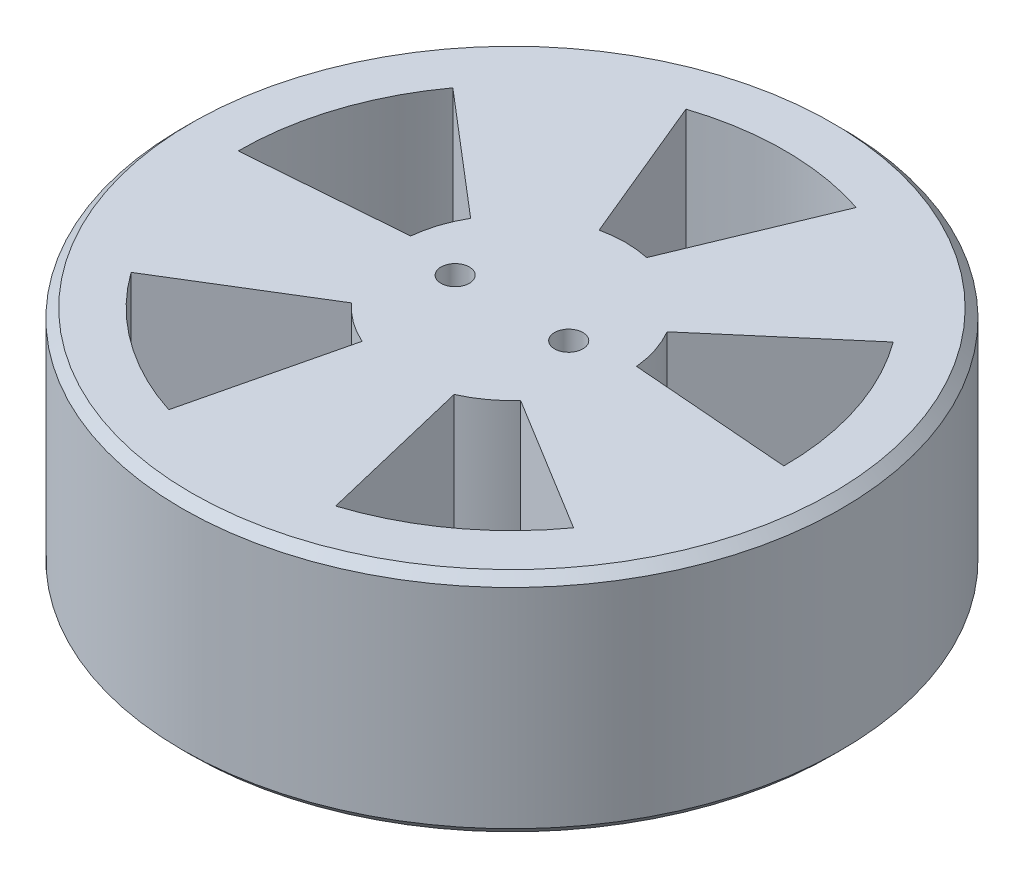
ISO-10303-21;
HEADER;
FILE_DESCRIPTION(('STEP AP214'),'2;1');
FILE_NAME('part.step','',(''),(''),'','','');
FILE_SCHEMA(('AUTOMOTIVE_DESIGN { 1 0 10303 214 1 1 1 1 }'));
ENDSEC;
DATA;
#1=APPLICATION_CONTEXT('core data for automotive mechanical design processes');
#2=APPLICATION_PROTOCOL_DEFINITION('international standard','automotive_design',2000,#1);
#3=PRODUCT_CONTEXT('',#1,'mechanical');
#4=PRODUCT('Part','Part','',(#3));
#5=PRODUCT_RELATED_PRODUCT_CATEGORY('part','',(#4));
#6=PRODUCT_DEFINITION_FORMATION('','',#4);
#7=PRODUCT_DEFINITION_CONTEXT('part definition',#1,'design');
#8=PRODUCT_DEFINITION('design','',#6,#7);
#9=PRODUCT_DEFINITION_SHAPE('','',#8);
#10=(LENGTH_UNIT() NAMED_UNIT(*) SI_UNIT(.MILLI.,.METRE.));
#11=(NAMED_UNIT(*) PLANE_ANGLE_UNIT() SI_UNIT($,.RADIAN.));
#12=(NAMED_UNIT(*) SI_UNIT($,.STERADIAN.) SOLID_ANGLE_UNIT());
#13=UNCERTAINTY_MEASURE_WITH_UNIT(LENGTH_MEASURE(1.E-05),#10,'distance_accuracy_value','');
#14=(GEOMETRIC_REPRESENTATION_CONTEXT(3) GLOBAL_UNCERTAINTY_ASSIGNED_CONTEXT((#13)) GLOBAL_UNIT_ASSIGNED_CONTEXT((#10,
#11,#12)) REPRESENTATION_CONTEXT('',''));
#15=CARTESIAN_POINT('',(0.,0.,0.));
#16=DIRECTION('',(0.,0.,1.));
#17=DIRECTION('',(1.,0.,0.));
#18=AXIS2_PLACEMENT_3D('',#15,#16,#17);
#19=CARTESIAN_POINT('',(0.,50.8,0.));
#20=DIRECTION('',(0.,1.,0.));
#21=DIRECTION('',(0.,0.,1.));
#22=AXIS2_PLACEMENT_3D('',#19,#20,#21);
#23=PLANE('',#22);
#24=CARTESIAN_POINT('',(-12.7,50.8,0.));
#25=DIRECTION('',(0.,1.,0.));
#26=DIRECTION('',(0.,0.,1.));
#27=AXIS2_PLACEMENT_3D('',#24,#25,#26);
#28=CIRCLE('',#27,3.175);
#29=CARTESIAN_POINT('',(-12.7,50.8,3.175));
#30=VERTEX_POINT('',#29);
#31=EDGE_CURVE('E298',#30,#30,#28,.T.);
#32=ORIENTED_EDGE('',*,*,#31,.F.);
#33=EDGE_LOOP('',(#32));
#34=FACE_BOUND('',#33,.T.);
#35=CARTESIAN_POINT('',(12.7,50.8,0.));
#36=DIRECTION('',(0.,1.,0.));
#37=DIRECTION('',(0.,0.,1.));
#38=AXIS2_PLACEMENT_3D('',#35,#36,#37);
#39=CIRCLE('',#38,3.175);
#40=CARTESIAN_POINT('',(12.7,50.8,3.175));
#41=VERTEX_POINT('',#40);
#42=EDGE_CURVE('E292',#41,#41,#39,.T.);
#43=ORIENTED_EDGE('',*,*,#42,.F.);
#44=EDGE_LOOP('',(#43));
#45=FACE_BOUND('',#44,.T.);
#46=CARTESIAN_POINT('',(0.,50.8,0.));
#47=DIRECTION('',(0.,1.,0.));
#48=DIRECTION('',(0.,0.,1.));
#49=AXIS2_PLACEMENT_3D('',#46,#47,#48);
#50=CIRCLE('',#49,71.6915000000001);
#51=CARTESIAN_POINT('',(0.,50.8,71.6915000000001));
#52=VERTEX_POINT('',#51);
#53=EDGE_CURVE('E11',#52,#52,#50,.T.);
#54=ORIENTED_EDGE('',*,*,#53,.T.);
#55=EDGE_LOOP('',(#54));
#56=FACE_BOUND('',#55,.T.);
#57=DIRECTION('',(-0.760405965600023,0.,-0.649448048330193));
#58=VECTOR('',#57,1.);
#59=CARTESIAN_POINT('',(-21.9751179277728,50.8,-12.7379037545617));
#60=LINE('',#59,#58);
#61=CARTESIAN_POINT('',(-21.9751179277728,50.8,-12.7379037545617));
#62=VERTEX_POINT('',#61);
#63=CARTESIAN_POINT('',(-49.2496157699846,50.8,-36.0325255673105));
#64=VERTEX_POINT('',#63);
#65=EDGE_CURVE('E281',#62,#64,#60,.T.);
#66=ORIENTED_EDGE('',*,*,#65,.F.);
#67=CARTESIAN_POINT('',(0.,50.8,0.));
#68=DIRECTION('',(0.,1.,0.));
#69=DIRECTION('',(0.,0.,1.));
#70=AXIS2_PLACEMENT_3D('',#67,#68,#69);
#71=CIRCLE('',#70,25.4);
#72=CARTESIAN_POINT('',(-25.265395829014,50.8,-2.61146962518046));
#73=VERTEX_POINT('',#72);
#74=EDGE_CURVE('E315',#62,#73,#71,.T.);
#75=ORIENTED_EDGE('',*,*,#74,.T.);
#76=DIRECTION('',(-0.996917333733129,0.,0.0784590957278343));
#77=VECTOR('',#76,1.);
#78=CARTESIAN_POINT('',(-25.265395829014,50.8,-2.61146962518046));
#79=LINE('',#78,#77);
#80=CARTESIAN_POINT('',(-61.0231632556706,50.8,0.202727703534772));
#81=VERTEX_POINT('',#80);
#82=EDGE_CURVE('E312',#73,#81,#79,.T.);
#83=ORIENTED_EDGE('',*,*,#82,.T.);
#84=CARTESIAN_POINT('',(0.,50.8,0.));
#85=DIRECTION('',(0.,1.,0.));
#86=DIRECTION('',(0.,0.,1.));
#87=AXIS2_PLACEMENT_3D('',#84,#85,#86);
#88=CIRCLE('',#87,61.0235);
#89=EDGE_CURVE('E310',#64,#81,#88,.T.);
#90=ORIENTED_EDGE('',*,*,#89,.F.);
#91=EDGE_LOOP('',(#66,#75,#83,#90));
#92=FACE_BOUND('',#91,.T.);
#93=DIRECTION('',(-0.852640164354097,0.,0.52249856471594));
#94=VECTOR('',#93,1.);
#95=CARTESIAN_POINT('',(-18.9051512627918,50.8,16.9633503686908));
#96=LINE('',#95,#94);
#97=CARTESIAN_POINT('',(-18.9051512627918,50.8,16.9633503686908));
#98=VERTEX_POINT('',#97);
#99=CARTESIAN_POINT('',(-49.4879364787239,50.8,35.7045052525278));
#100=VERTEX_POINT('',#99);
#101=EDGE_CURVE('E318',#98,#100,#96,.T.);
#102=ORIENTED_EDGE('',*,*,#101,.F.);
#103=CARTESIAN_POINT('',(0.,50.8,0.));
#104=DIRECTION('',(0.,1.,0.));
#105=DIRECTION('',(0.,0.,1.));
#106=AXIS2_PLACEMENT_3D('',#103,#104,#105);
#107=CIRCLE('',#106,25.4);
#108=CARTESIAN_POINT('',(-10.2910918849099,50.8,23.2218308454855));
#109=VERTEX_POINT('',#108);
#110=EDGE_CURVE('E183',#98,#109,#107,.T.);
#111=ORIENTED_EDGE('',*,*,#110,.T.);
#112=DIRECTION('',(-0.233445363855913,0.,0.972369920397675));
#113=VECTOR('',#112,1.);
#114=CARTESIAN_POINT('',(-10.2910918849099,50.8,23.2218308454855));
#115=LINE('',#114,#113);
#116=CARTESIAN_POINT('',(-18.6643889930386,50.8,58.0991233648713));
#117=VERTEX_POINT('',#116);
#118=EDGE_CURVE('E322',#109,#117,#115,.T.);
#119=ORIENTED_EDGE('',*,*,#118,.T.);
#120=CARTESIAN_POINT('',(0.,50.8,0.));
#121=DIRECTION('',(0.,1.,0.));
#122=DIRECTION('',(0.,0.,1.));
#123=AXIS2_PLACEMENT_3D('',#120,#121,#122);
#124=CIRCLE('',#123,61.0235);
#125=EDGE_CURVE('E320',#100,#117,#124,.T.);
#126=ORIENTED_EDGE('',*,*,#125,.F.);
#127=EDGE_LOOP('',(#102,#111,#119,#126));
#128=FACE_BOUND('',#127,.T.);
#129=DIRECTION('',(0.233445363855899,0.,0.972369920397678));
#130=VECTOR('',#129,1.);
#131=CARTESIAN_POINT('',(10.2910918849096,50.8,23.2218308454856));
#132=LINE('',#131,#130);
#133=CARTESIAN_POINT('',(10.2910918849096,50.8,23.2218308454856));
#134=VERTEX_POINT('',#133);
#135=CARTESIAN_POINT('',(18.6643889930378,50.8,58.0991233648716));
#136=VERTEX_POINT('',#135);
#137=EDGE_CURVE('E326',#134,#136,#132,.T.);
#138=ORIENTED_EDGE('',*,*,#137,.F.);
#139=CARTESIAN_POINT('',(0.,50.8,0.));
#140=DIRECTION('',(0.,1.,0.));
#141=DIRECTION('',(0.,0.,1.));
#142=AXIS2_PLACEMENT_3D('',#139,#140,#141);
#143=CIRCLE('',#142,25.4);
#144=CARTESIAN_POINT('',(18.9051512627915,50.8,16.9633503686911));
#145=VERTEX_POINT('',#144);
#146=EDGE_CURVE('E333',#134,#145,#143,.T.);
#147=ORIENTED_EDGE('',*,*,#146,.T.);
#148=DIRECTION('',(0.85264016435409,0.,0.522498564715953));
#149=VECTOR('',#148,1.);
#150=CARTESIAN_POINT('',(18.9051512627915,50.8,16.9633503686911));
#151=LINE('',#150,#149);
#152=CARTESIAN_POINT('',(49.4879364787234,50.8,35.7045052525286));
#153=VERTEX_POINT('',#152);
#154=EDGE_CURVE('E330',#145,#153,#151,.T.);
#155=ORIENTED_EDGE('',*,*,#154,.T.);
#156=CARTESIAN_POINT('',(0.,50.8,0.));
#157=DIRECTION('',(0.,1.,0.));
#158=DIRECTION('',(0.,0.,1.));
#159=AXIS2_PLACEMENT_3D('',#156,#157,#158);
#160=CIRCLE('',#159,61.0235);
#161=EDGE_CURVE('E328',#136,#153,#160,.T.);
#162=ORIENTED_EDGE('',*,*,#161,.F.);
#163=EDGE_LOOP('',(#138,#147,#155,#162));
#164=FACE_BOUND('',#163,.T.);
#165=DIRECTION('',(0.996917333733128,0.,0.0784590957278489));
#166=VECTOR('',#165,1.);
#167=CARTESIAN_POINT('',(25.2653958290141,50.8,-2.61146962518011));
#168=LINE('',#167,#166);
#169=CARTESIAN_POINT('',(25.2653958290141,50.8,-2.61146962518011));
#170=VERTEX_POINT('',#169);
#171=CARTESIAN_POINT('',(61.0231632556706,50.8,0.202727703535641));
#172=VERTEX_POINT('',#171);
#173=EDGE_CURVE('E336',#170,#172,#168,.T.);
#174=ORIENTED_EDGE('',*,*,#173,.F.);
#175=CARTESIAN_POINT('',(0.,50.8,0.));
#176=DIRECTION('',(0.,1.,0.));
#177=DIRECTION('',(0.,0.,1.));
#178=AXIS2_PLACEMENT_3D('',#175,#176,#177);
#179=CIRCLE('',#178,25.4);
#180=CARTESIAN_POINT('',(21.975117927773,50.8,-12.7379037545614));
#181=VERTEX_POINT('',#180);
#182=EDGE_CURVE('E343',#170,#181,#179,.T.);
#183=ORIENTED_EDGE('',*,*,#182,.T.);
#184=DIRECTION('',(0.760405965600032,0.,-0.649448048330182));
#185=VECTOR('',#184,1.);
#186=CARTESIAN_POINT('',(21.975117927773,50.8,-12.7379037545614));
#187=LINE('',#186,#185);
#188=CARTESIAN_POINT('',(49.2496157699852,50.8,-36.0325255673097));
#189=VERTEX_POINT('',#188);
#190=EDGE_CURVE('E340',#181,#189,#187,.T.);
#191=ORIENTED_EDGE('',*,*,#190,.T.);
#192=CARTESIAN_POINT('',(0.,50.8,0.));
#193=DIRECTION('',(0.,1.,0.));
#194=DIRECTION('',(0.,0.,1.));
#195=AXIS2_PLACEMENT_3D('',#192,#193,#194);
#196=CIRCLE('',#195,61.0235);
#197=EDGE_CURVE('E338',#172,#189,#196,.T.);
#198=ORIENTED_EDGE('',*,*,#197,.F.);
#199=EDGE_LOOP('',(#174,#183,#191,#198));
#200=FACE_BOUND('',#199,.T.);
#201=CARTESIAN_POINT('',(0.,50.8,0.));
#202=DIRECTION('',(0.,1.,0.));
#203=DIRECTION('',(0.,0.,1.));
#204=AXIS2_PLACEMENT_3D('',#201,#202,#203);
#205=CIRCLE('',#204,25.4);
#206=CARTESIAN_POINT('',(5.32378147664079,50.8,-24.8358078344349));
#207=VERTEX_POINT('',#206);
#208=CARTESIAN_POINT('',(-5.3237814766408,50.8,-24.8358078344349));
#209=VERTEX_POINT('',#208);
#210=EDGE_CURVE('E346',#207,#209,#205,.T.);
#211=ORIENTED_EDGE('',*,*,#210,.T.);
#212=DIRECTION('',(-0.38268343236509,0.,-0.923879532511286));
#213=VECTOR('',#212,1.);
#214=CARTESIAN_POINT('',(-5.3237814766408,50.8,-24.8358078344349));
#215=LINE('',#214,#213);
#216=CARTESIAN_POINT('',(-19.05,50.8,-57.9738307536254));
#217=VERTEX_POINT('',#216);
#218=EDGE_CURVE('E46',#209,#217,#215,.T.);
#219=ORIENTED_EDGE('',*,*,#218,.T.);
#220=CARTESIAN_POINT('',(0.,50.8,0.));
#221=DIRECTION('',(0.,1.,0.));
#222=DIRECTION('',(0.,0.,1.));
#223=AXIS2_PLACEMENT_3D('',#220,#221,#222);
#224=CIRCLE('',#223,61.0235);
#225=CARTESIAN_POINT('',(19.05,50.8,-57.9738307536254));
#226=VERTEX_POINT('',#225);
#227=EDGE_CURVE('E350',#217,#226,#224,.F.);
#228=ORIENTED_EDGE('',*,*,#227,.T.);
#229=DIRECTION('',(0.382683432365091,0.,-0.923879532511286));
#230=VECTOR('',#229,1.);
#231=CARTESIAN_POINT('',(5.32378147664079,50.8,-24.8358078344349));
#232=LINE('',#231,#230);
#233=EDGE_CURVE('E349',#207,#226,#232,.T.);
#234=ORIENTED_EDGE('',*,*,#233,.F.);
#235=EDGE_LOOP('',(#211,#219,#228,#234));
#236=FACE_BOUND('',#235,.T.);
#237=ADVANCED_FACE('F41',(#34,#45,#56,#92,#128,#164,#200,#236),#23,.T.);
#238=CARTESIAN_POINT('',(0.,0.,0.));
#239=DIRECTION('',(0.,1.,0.));
#240=DIRECTION('',(0.,0.,1.));
#241=AXIS2_PLACEMENT_3D('',#238,#239,#240);
#242=PLANE('',#241);
#243=CARTESIAN_POINT('',(0.,0.,0.));
#244=DIRECTION('',(0.,1.,0.));
#245=DIRECTION('',(0.,0.,1.));
#246=AXIS2_PLACEMENT_3D('',#243,#244,#245);
#247=CIRCLE('',#246,25.4);
#248=CARTESIAN_POINT('',(25.2653958290141,0.,-2.61146962518011));
#249=VERTEX_POINT('',#248);
#250=CARTESIAN_POINT('',(21.975117927773,0.,-12.7379037545614));
#251=VERTEX_POINT('',#250);
#252=EDGE_CURVE('E220',#249,#251,#247,.T.);
#253=ORIENTED_EDGE('',*,*,#252,.F.);
#254=DIRECTION('',(0.996917333733128,0.,0.0784590957278489));
#255=VECTOR('',#254,1.);
#256=CARTESIAN_POINT('',(25.2653958290141,0.,-2.61146962518011));
#257=LINE('',#256,#255);
#258=CARTESIAN_POINT('',(61.0231632556706,0.,0.202727703535643));
#259=VERTEX_POINT('',#258);
#260=EDGE_CURVE('E233',#249,#259,#257,.T.);
#261=ORIENTED_EDGE('',*,*,#260,.T.);
#262=CARTESIAN_POINT('',(0.,0.,0.));
#263=DIRECTION('',(0.,1.,0.));
#264=DIRECTION('',(0.,0.,1.));
#265=AXIS2_PLACEMENT_3D('',#262,#263,#264);
#266=CIRCLE('',#265,61.0235);
#267=CARTESIAN_POINT('',(49.2496157699852,0.,-36.0325255673098));
#268=VERTEX_POINT('',#267);
#269=EDGE_CURVE('E246',#259,#268,#266,.T.);
#270=ORIENTED_EDGE('',*,*,#269,.T.);
#271=DIRECTION('',(0.760405965600032,0.,-0.649448048330182));
#272=VECTOR('',#271,1.);
#273=CARTESIAN_POINT('',(21.975117927773,0.,-12.7379037545614));
#274=LINE('',#273,#272);
#275=EDGE_CURVE('E249',#251,#268,#274,.T.);
#276=ORIENTED_EDGE('',*,*,#275,.F.);
#277=EDGE_LOOP('',(#253,#261,#270,#276));
#278=FACE_BOUND('',#277,.T.);
#279=CARTESIAN_POINT('',(0.,0.,0.));
#280=DIRECTION('',(0.,1.,0.));
#281=DIRECTION('',(0.,0.,1.));
#282=AXIS2_PLACEMENT_3D('',#279,#280,#281);
#283=CIRCLE('',#282,25.4);
#284=CARTESIAN_POINT('',(-18.9051512627918,0.,16.9633503686908));
#285=VERTEX_POINT('',#284);
#286=CARTESIAN_POINT('',(-10.2910918849099,0.,23.2218308454855));
#287=VERTEX_POINT('',#286);
#288=EDGE_CURVE('E180',#285,#287,#283,.T.);
#289=ORIENTED_EDGE('',*,*,#288,.F.);
#290=DIRECTION('',(-0.852640164354098,0.,0.52249856471594));
#291=VECTOR('',#290,1.);
#292=CARTESIAN_POINT('',(-18.9051512627918,0.,16.9633503686908));
#293=LINE('',#292,#291);
#294=CARTESIAN_POINT('',(-49.4879364787239,0.,35.7045052525278));
#295=VERTEX_POINT('',#294);
#296=EDGE_CURVE('E186',#285,#295,#293,.T.);
#297=ORIENTED_EDGE('',*,*,#296,.T.);
#298=CARTESIAN_POINT('',(0.,0.,0.));
#299=DIRECTION('',(0.,1.,0.));
#300=DIRECTION('',(0.,0.,1.));
#301=AXIS2_PLACEMENT_3D('',#298,#299,#300);
#302=CIRCLE('',#301,61.0235);
#303=CARTESIAN_POINT('',(-18.6643889930386,0.,58.0991233648713));
#304=VERTEX_POINT('',#303);
#305=EDGE_CURVE('E195',#295,#304,#302,.T.);
#306=ORIENTED_EDGE('',*,*,#305,.T.);
#307=DIRECTION('',(-0.233445363855913,0.,0.972369920397675));
#308=VECTOR('',#307,1.);
#309=CARTESIAN_POINT('',(-10.2910918849099,0.,23.2218308454855));
#310=LINE('',#309,#308);
#311=EDGE_CURVE('E200',#287,#304,#310,.T.);
#312=ORIENTED_EDGE('',*,*,#311,.F.);
#313=EDGE_LOOP('',(#289,#297,#306,#312));
#314=FACE_BOUND('',#313,.T.);
#315=CARTESIAN_POINT('',(0.,0.,0.));
#316=DIRECTION('',(0.,1.,0.));
#317=DIRECTION('',(0.,0.,1.));
#318=AXIS2_PLACEMENT_3D('',#315,#316,#317);
#319=CIRCLE('',#318,71.6915);
#320=CARTESIAN_POINT('',(0.,0.,71.6915));
#321=VERTEX_POINT('',#320);
#322=EDGE_CURVE('E52',#321,#321,#319,.F.);
#323=ORIENTED_EDGE('',*,*,#322,.T.);
#324=EDGE_LOOP('',(#323));
#325=FACE_BOUND('',#324,.T.);
#326=CARTESIAN_POINT('',(12.7,0.,0.));
#327=DIRECTION('',(0.,1.,0.));
#328=DIRECTION('',(0.,0.,1.));
#329=AXIS2_PLACEMENT_3D('',#326,#327,#328);
#330=CIRCLE('',#329,3.175);
#331=CARTESIAN_POINT('',(12.7,0.,3.175));
#332=VERTEX_POINT('',#331);
#333=EDGE_CURVE('E293',#332,#332,#330,.T.);
#334=ORIENTED_EDGE('',*,*,#333,.T.);
#335=EDGE_LOOP('',(#334));
#336=FACE_BOUND('',#335,.T.);
#337=CARTESIAN_POINT('',(-12.7,0.,0.));
#338=DIRECTION('',(0.,1.,0.));
#339=DIRECTION('',(0.,0.,1.));
#340=AXIS2_PLACEMENT_3D('',#337,#338,#339);
#341=CIRCLE('',#340,3.175);
#342=CARTESIAN_POINT('',(-12.7,0.,3.175));
#343=VERTEX_POINT('',#342);
#344=EDGE_CURVE('E289',#343,#343,#341,.T.);
#345=ORIENTED_EDGE('',*,*,#344,.T.);
#346=EDGE_LOOP('',(#345));
#347=FACE_BOUND('',#346,.T.);
#348=CARTESIAN_POINT('',(0.,0.,0.));
#349=DIRECTION('',(0.,1.,0.));
#350=DIRECTION('',(0.,0.,1.));
#351=AXIS2_PLACEMENT_3D('',#348,#349,#350);
#352=CIRCLE('',#351,25.4);
#353=CARTESIAN_POINT('',(-21.9751179277728,0.,-12.7379037545617));
#354=VERTEX_POINT('',#353);
#355=CARTESIAN_POINT('',(-25.265395829014,0.,-2.61146962518046));
#356=VERTEX_POINT('',#355);
#357=EDGE_CURVE('E201',#354,#356,#352,.T.);
#358=ORIENTED_EDGE('',*,*,#357,.F.);
#359=DIRECTION('',(-0.760405965600023,0.,-0.649448048330193));
#360=VECTOR('',#359,1.);
#361=CARTESIAN_POINT('',(-21.9751179277728,0.,-12.7379037545617));
#362=LINE('',#361,#360);
#363=CARTESIAN_POINT('',(-49.2496157699847,0.,-36.0325255673105));
#364=VERTEX_POINT('',#363);
#365=EDGE_CURVE('E274',#354,#364,#362,.T.);
#366=ORIENTED_EDGE('',*,*,#365,.T.);
#367=CARTESIAN_POINT('',(0.,0.,0.));
#368=DIRECTION('',(0.,1.,0.));
#369=DIRECTION('',(0.,0.,1.));
#370=AXIS2_PLACEMENT_3D('',#367,#368,#369);
#371=CIRCLE('',#370,61.0235);
#372=CARTESIAN_POINT('',(-61.0231632556706,0.,0.202727703534772));
#373=VERTEX_POINT('',#372);
#374=EDGE_CURVE('E271',#364,#373,#371,.T.);
#375=ORIENTED_EDGE('',*,*,#374,.T.);
#376=DIRECTION('',(-0.996917333733129,0.,0.0784590957278344));
#377=VECTOR('',#376,1.);
#378=CARTESIAN_POINT('',(-25.265395829014,0.,-2.61146962518046));
#379=LINE('',#378,#377);
#380=EDGE_CURVE('E203',#356,#373,#379,.T.);
#381=ORIENTED_EDGE('',*,*,#380,.F.);
#382=EDGE_LOOP('',(#358,#366,#375,#381));
#383=FACE_BOUND('',#382,.T.);
#384=CARTESIAN_POINT('',(0.,0.,0.));
#385=DIRECTION('',(0.,1.,0.));
#386=DIRECTION('',(0.,0.,1.));
#387=AXIS2_PLACEMENT_3D('',#384,#385,#386);
#388=CIRCLE('',#387,25.4);
#389=CARTESIAN_POINT('',(10.2910918849096,0.,23.2218308454856));
#390=VERTEX_POINT('',#389);
#391=CARTESIAN_POINT('',(18.9051512627915,0.,16.9633503686911));
#392=VERTEX_POINT('',#391);
#393=EDGE_CURVE('E228',#390,#392,#388,.T.);
#394=ORIENTED_EDGE('',*,*,#393,.F.);
#395=DIRECTION('',(0.233445363855899,0.,0.972369920397678));
#396=VECTOR('',#395,1.);
#397=CARTESIAN_POINT('',(10.2910918849096,0.,23.2218308454856));
#398=LINE('',#397,#396);
#399=CARTESIAN_POINT('',(18.6643889930378,0.,58.0991233648716));
#400=VERTEX_POINT('',#399);
#401=EDGE_CURVE('E210',#390,#400,#398,.T.);
#402=ORIENTED_EDGE('',*,*,#401,.T.);
#403=CARTESIAN_POINT('',(0.,0.,0.));
#404=DIRECTION('',(0.,1.,0.));
#405=DIRECTION('',(0.,0.,1.));
#406=AXIS2_PLACEMENT_3D('',#403,#404,#405);
#407=CIRCLE('',#406,61.0235);
#408=CARTESIAN_POINT('',(49.4879364787234,0.,35.7045052525286));
#409=VERTEX_POINT('',#408);
#410=EDGE_CURVE('E223',#400,#409,#407,.T.);
#411=ORIENTED_EDGE('',*,*,#410,.T.);
#412=DIRECTION('',(0.85264016435409,0.,0.522498564715953));
#413=VECTOR('',#412,1.);
#414=CARTESIAN_POINT('',(18.9051512627915,0.,16.9633503686911));
#415=LINE('',#414,#413);
#416=EDGE_CURVE('E226',#392,#409,#415,.T.);
#417=ORIENTED_EDGE('',*,*,#416,.F.);
#418=EDGE_LOOP('',(#394,#402,#411,#417));
#419=FACE_BOUND('',#418,.T.);
#420=DIRECTION('',(-0.38268343236509,0.,-0.923879532511287));
#421=VECTOR('',#420,1.);
#422=CARTESIAN_POINT('',(-5.3237814766408,0.,-24.8358078344349));
#423=LINE('',#422,#421);
#424=CARTESIAN_POINT('',(-5.32378147664079,0.,-24.8358078344349));
#425=VERTEX_POINT('',#424);
#426=CARTESIAN_POINT('',(-19.05,0.,-57.9738307536254));
#427=VERTEX_POINT('',#426);
#428=EDGE_CURVE('E243',#425,#427,#423,.T.);
#429=ORIENTED_EDGE('',*,*,#428,.F.);
#430=CARTESIAN_POINT('',(0.,0.,0.));
#431=DIRECTION('',(0.,1.,0.));
#432=DIRECTION('',(0.,0.,1.));
#433=AXIS2_PLACEMENT_3D('',#430,#431,#432);
#434=CIRCLE('',#433,25.4);
#435=CARTESIAN_POINT('',(5.32378147664078,0.,-24.8358078344349));
#436=VERTEX_POINT('',#435);
#437=EDGE_CURVE('E253',#436,#425,#434,.T.);
#438=ORIENTED_EDGE('',*,*,#437,.F.);
#439=DIRECTION('',(0.382683432365091,0.,-0.923879532511286));
#440=VECTOR('',#439,1.);
#441=CARTESIAN_POINT('',(5.32378147664079,0.,-24.8358078344349));
#442=LINE('',#441,#440);
#443=CARTESIAN_POINT('',(19.05,0.,-57.9738307536254));
#444=VERTEX_POINT('',#443);
#445=EDGE_CURVE('E264',#436,#444,#442,.T.);
#446=ORIENTED_EDGE('',*,*,#445,.T.);
#447=CARTESIAN_POINT('',(0.,0.,0.));
#448=DIRECTION('',(0.,-1.,0.));
#449=DIRECTION('',(0.,0.,-1.));
#450=AXIS2_PLACEMENT_3D('',#447,#448,#449);
#451=CIRCLE('',#450,61.0235);
#452=EDGE_CURVE('E267',#427,#444,#451,.T.);
#453=ORIENTED_EDGE('',*,*,#452,.F.);
#454=EDGE_LOOP('',(#429,#438,#446,#453));
#455=FACE_BOUND('',#454,.T.);
#456=ADVANCED_FACE('F198',(#278,#314,#325,#336,#347,#383,#419,#455),#242,.F.);
#457=CARTESIAN_POINT('',(0.,50.8,0.));
#458=DIRECTION('',(0.,-1.,0.));
#459=DIRECTION('',(0.,0.,-1.));
#460=AXIS2_PLACEMENT_3D('',#457,#458,#459);
#461=CYLINDRICAL_SURFACE('',#460,73.7235);
#462=CARTESIAN_POINT('',(0.,2.03199999999999,0.));
#463=DIRECTION('',(0.,1.,0.));
#464=DIRECTION('',(0.,0.,1.));
#465=AXIS2_PLACEMENT_3D('',#462,#463,#464);
#466=CIRCLE('',#465,73.7235);
#467=CARTESIAN_POINT('',(0.,2.03199999999999,73.7235));
#468=VERTEX_POINT('',#467);
#469=EDGE_CURVE('E304',#468,#468,#466,.T.);
#470=ORIENTED_EDGE('',*,*,#469,.T.);
#471=EDGE_LOOP('',(#470));
#472=FACE_BOUND('',#471,.T.);
#473=CARTESIAN_POINT('',(0.,48.768,0.));
#474=DIRECTION('',(0.,1.,0.));
#475=DIRECTION('',(0.,0.,1.));
#476=AXIS2_PLACEMENT_3D('',#473,#474,#475);
#477=CIRCLE('',#476,73.7235);
#478=CARTESIAN_POINT('',(0.,48.768,73.7235));
#479=VERTEX_POINT('',#478);
#480=EDGE_CURVE('E301',#479,#479,#477,.F.);
#481=ORIENTED_EDGE('',*,*,#480,.T.);
#482=EDGE_LOOP('',(#481));
#483=FACE_BOUND('',#482,.T.);
#484=ADVANCED_FACE('F384',(#472,#483),#461,.T.);
#485=CARTESIAN_POINT('',(0.,2.03199999999999,0.));
#486=DIRECTION('',(0.,1.,0.));
#487=DIRECTION('',(0.,0.,1.));
#488=AXIS2_PLACEMENT_3D('',#485,#486,#487);
#489=CONICAL_SURFACE('',#488,73.7235,0.785398163397452);
#490=ORIENTED_EDGE('',*,*,#322,.F.);
#491=EDGE_LOOP('',(#490));
#492=FACE_BOUND('',#491,.T.);
#493=ORIENTED_EDGE('',*,*,#469,.F.);
#494=EDGE_LOOP('',(#493));
#495=FACE_BOUND('',#494,.T.);
#496=ADVANCED_FACE('F394',(#492,#495),#489,.T.);
#497=CARTESIAN_POINT('',(0.,50.8,0.));
#498=DIRECTION('',(0.,-1.,0.));
#499=DIRECTION('',(0.,0.,-1.));
#500=AXIS2_PLACEMENT_3D('',#497,#498,#499);
#501=CONICAL_SURFACE('',#500,71.6915000000001,0.785398163397438);
#502=ORIENTED_EDGE('',*,*,#480,.F.);
#503=EDGE_LOOP('',(#502));
#504=FACE_BOUND('',#503,.T.);
#505=ORIENTED_EDGE('',*,*,#53,.F.);
#506=EDGE_LOOP('',(#505));
#507=FACE_BOUND('',#506,.T.);
#508=ADVANCED_FACE('F44',(#504,#507),#501,.T.);
#509=CARTESIAN_POINT('',(12.7,0.,0.));
#510=DIRECTION('',(0.,1.,0.));
#511=DIRECTION('',(0.,0.,1.));
#512=AXIS2_PLACEMENT_3D('',#509,#510,#511);
#513=CYLINDRICAL_SURFACE('',#512,3.175);
#514=ORIENTED_EDGE('',*,*,#42,.T.);
#515=EDGE_LOOP('',(#514));
#516=FACE_BOUND('',#515,.T.);
#517=ORIENTED_EDGE('',*,*,#333,.F.);
#518=EDGE_LOOP('',(#517));
#519=FACE_BOUND('',#518,.T.);
#520=ADVANCED_FACE('F390',(#516,#519),#513,.F.);
#521=CARTESIAN_POINT('',(-12.7,0.,0.));
#522=DIRECTION('',(0.,1.,0.));
#523=DIRECTION('',(0.,0.,1.));
#524=AXIS2_PLACEMENT_3D('',#521,#522,#523);
#525=CYLINDRICAL_SURFACE('',#524,3.175);
#526=ORIENTED_EDGE('',*,*,#31,.T.);
#527=EDGE_LOOP('',(#526));
#528=FACE_BOUND('',#527,.T.);
#529=ORIENTED_EDGE('',*,*,#344,.F.);
#530=EDGE_LOOP('',(#529));
#531=FACE_BOUND('',#530,.T.);
#532=ADVANCED_FACE('F593',(#528,#531),#525,.F.);
#533=CARTESIAN_POINT('',(0.,0.,0.));
#534=DIRECTION('',(0.,1.,0.));
#535=DIRECTION('',(0.,0.,1.));
#536=AXIS2_PLACEMENT_3D('',#533,#534,#535);
#537=CYLINDRICAL_SURFACE('',#536,25.4);
#538=DIRECTION('',(0.,1.,0.));
#539=VECTOR('',#538,1.);
#540=CARTESIAN_POINT('',(-21.9751179277728,0.,-12.7379037545617));
#541=LINE('',#540,#539);
#542=EDGE_CURVE('E277',#354,#62,#541,.T.);
#543=ORIENTED_EDGE('',*,*,#542,.F.);
#544=ORIENTED_EDGE('',*,*,#357,.T.);
#545=DIRECTION('',(0.,1.,0.));
#546=VECTOR('',#545,1.);
#547=CARTESIAN_POINT('',(-25.265395829014,0.,-2.61146962518046));
#548=LINE('',#547,#546);
#549=EDGE_CURVE('E278',#356,#73,#548,.T.);
#550=ORIENTED_EDGE('',*,*,#549,.T.);
#551=ORIENTED_EDGE('',*,*,#74,.F.);
#552=EDGE_LOOP('',(#543,#544,#550,#551));
#553=FACE_BOUND('',#552,.T.);
#554=ADVANCED_FACE('F585',(#553),#537,.T.);
#555=CARTESIAN_POINT('',(-25.265395829014,0.,-2.61146962518046));
#556=DIRECTION('',(-0.0784590957278344,0.,-0.996917333733129));
#557=DIRECTION('',(-0.996917333733129,0.,0.0784590957278344));
#558=AXIS2_PLACEMENT_3D('',#555,#556,#557);
#559=PLANE('',#558);
#560=ORIENTED_EDGE('',*,*,#549,.F.);
#561=ORIENTED_EDGE('',*,*,#380,.T.);
#562=DIRECTION('',(0.,1.,0.));
#563=VECTOR('',#562,1.);
#564=CARTESIAN_POINT('',(-61.0231632556706,0.,0.202727703534772));
#565=LINE('',#564,#563);
#566=EDGE_CURVE('E282',#373,#81,#565,.T.);
#567=ORIENTED_EDGE('',*,*,#566,.T.);
#568=ORIENTED_EDGE('',*,*,#82,.F.);
#569=EDGE_LOOP('',(#560,#561,#567,#568));
#570=FACE_BOUND('',#569,.T.);
#571=ADVANCED_FACE('F576',(#570),#559,.T.);
#572=CARTESIAN_POINT('',(0.,0.,0.));
#573=DIRECTION('',(0.,1.,0.));
#574=DIRECTION('',(0.,0.,1.));
#575=AXIS2_PLACEMENT_3D('',#572,#573,#574);
#576=CYLINDRICAL_SURFACE('',#575,61.0235);
#577=ORIENTED_EDGE('',*,*,#89,.T.);
#578=ORIENTED_EDGE('',*,*,#566,.F.);
#579=ORIENTED_EDGE('',*,*,#374,.F.);
#580=DIRECTION('',(0.,1.,0.));
#581=VECTOR('',#580,1.);
#582=CARTESIAN_POINT('',(-49.2496157699846,0.,-36.0325255673105));
#583=LINE('',#582,#581);
#584=EDGE_CURVE('E285',#364,#64,#583,.T.);
#585=ORIENTED_EDGE('',*,*,#584,.T.);
#586=EDGE_LOOP('',(#577,#578,#579,#585));
#587=FACE_BOUND('',#586,.T.);
#588=ADVANCED_FACE('F568',(#587),#576,.F.);
#589=CARTESIAN_POINT('',(-21.9751179277728,0.,-12.7379037545617));
#590=DIRECTION('',(0.649448048330193,0.,-0.760405965600023));
#591=DIRECTION('',(-0.760405965600023,0.,-0.649448048330193));
#592=AXIS2_PLACEMENT_3D('',#589,#590,#591);
#593=PLANE('',#592);
#594=ORIENTED_EDGE('',*,*,#65,.T.);
#595=ORIENTED_EDGE('',*,*,#584,.F.);
#596=ORIENTED_EDGE('',*,*,#365,.F.);
#597=ORIENTED_EDGE('',*,*,#542,.T.);
#598=EDGE_LOOP('',(#594,#595,#596,#597));
#599=FACE_BOUND('',#598,.T.);
#600=ADVANCED_FACE('F560',(#599),#593,.F.);
#601=CARTESIAN_POINT('',(0.,0.,0.));
#602=DIRECTION('',(0.,1.,0.));
#603=DIRECTION('',(0.,0.,1.));
#604=AXIS2_PLACEMENT_3D('',#601,#602,#603);
#605=CYLINDRICAL_SURFACE('',#604,25.4);
#606=DIRECTION('',(0.,1.,0.));
#607=VECTOR('',#606,1.);
#608=CARTESIAN_POINT('',(-18.9051512627918,0.,16.9633503686908));
#609=LINE('',#608,#607);
#610=EDGE_CURVE('E175',#285,#98,#609,.T.);
#611=ORIENTED_EDGE('',*,*,#610,.F.);
#612=ORIENTED_EDGE('',*,*,#288,.T.);
#613=DIRECTION('',(0.,1.,0.));
#614=VECTOR('',#613,1.);
#615=CARTESIAN_POINT('',(-10.2910918849099,0.,23.2218308454855));
#616=LINE('',#615,#614);
#617=EDGE_CURVE('E230',#287,#109,#616,.T.);
#618=ORIENTED_EDGE('',*,*,#617,.T.);
#619=ORIENTED_EDGE('',*,*,#110,.F.);
#620=EDGE_LOOP('',(#611,#612,#618,#619));
#621=FACE_BOUND('',#620,.T.);
#622=ADVANCED_FACE('F177',(#621),#605,.T.);
#623=CARTESIAN_POINT('',(-10.2910918849099,0.,23.2218308454855));
#624=DIRECTION('',(-0.972369920397675,0.,-0.233445363855913));
#625=DIRECTION('',(-0.233445363855913,0.,0.972369920397675));
#626=AXIS2_PLACEMENT_3D('',#623,#624,#625);
#627=PLANE('',#626);
#628=ORIENTED_EDGE('',*,*,#617,.F.);
#629=ORIENTED_EDGE('',*,*,#311,.T.);
#630=DIRECTION('',(0.,1.,0.));
#631=VECTOR('',#630,1.);
#632=CARTESIAN_POINT('',(-18.6643889930386,0.,58.0991233648713));
#633=LINE('',#632,#631);
#634=EDGE_CURVE('E677',#304,#117,#633,.T.);
#635=ORIENTED_EDGE('',*,*,#634,.T.);
#636=ORIENTED_EDGE('',*,*,#118,.F.);
#637=EDGE_LOOP('',(#628,#629,#635,#636));
#638=FACE_BOUND('',#637,.T.);
#639=ADVANCED_FACE('F543',(#638),#627,.T.);
#640=CARTESIAN_POINT('',(0.,0.,0.));
#641=DIRECTION('',(0.,1.,0.));
#642=DIRECTION('',(0.,0.,1.));
#643=AXIS2_PLACEMENT_3D('',#640,#641,#642);
#644=CYLINDRICAL_SURFACE('',#643,61.0235);
#645=ORIENTED_EDGE('',*,*,#125,.T.);
#646=ORIENTED_EDGE('',*,*,#634,.F.);
#647=ORIENTED_EDGE('',*,*,#305,.F.);
#648=DIRECTION('',(0.,1.,0.));
#649=VECTOR('',#648,1.);
#650=CARTESIAN_POINT('',(-49.4879364787239,0.,35.7045052525278));
#651=LINE('',#650,#649);
#652=EDGE_CURVE('E187',#295,#100,#651,.T.);
#653=ORIENTED_EDGE('',*,*,#652,.T.);
#654=EDGE_LOOP('',(#645,#646,#647,#653));
#655=FACE_BOUND('',#654,.T.);
#656=ADVANCED_FACE('F535',(#655),#644,.F.);
#657=CARTESIAN_POINT('',(-18.9051512627918,0.,16.9633503686908));
#658=DIRECTION('',(-0.52249856471594,0.,-0.852640164354097));
#659=DIRECTION('',(-0.852640164354097,0.,0.52249856471594));
#660=AXIS2_PLACEMENT_3D('',#657,#658,#659);
#661=PLANE('',#660);
#662=ORIENTED_EDGE('',*,*,#101,.T.);
#663=ORIENTED_EDGE('',*,*,#652,.F.);
#664=ORIENTED_EDGE('',*,*,#296,.F.);
#665=ORIENTED_EDGE('',*,*,#610,.T.);
#666=EDGE_LOOP('',(#662,#663,#664,#665));
#667=FACE_BOUND('',#666,.T.);
#668=ADVANCED_FACE('F191',(#667),#661,.F.);
#669=CARTESIAN_POINT('',(0.,0.,0.));
#670=DIRECTION('',(0.,1.,0.));
#671=DIRECTION('',(0.,0.,1.));
#672=AXIS2_PLACEMENT_3D('',#669,#670,#671);
#673=CYLINDRICAL_SURFACE('',#672,25.4);
#674=DIRECTION('',(0.,1.,0.));
#675=VECTOR('',#674,1.);
#676=CARTESIAN_POINT('',(10.2910918849096,0.,23.2218308454856));
#677=LINE('',#676,#675);
#678=EDGE_CURVE('E208',#390,#134,#677,.T.);
#679=ORIENTED_EDGE('',*,*,#678,.F.);
#680=ORIENTED_EDGE('',*,*,#393,.T.);
#681=DIRECTION('',(0.,1.,0.));
#682=VECTOR('',#681,1.);
#683=CARTESIAN_POINT('',(18.9051512627915,0.,16.9633503686911));
#684=LINE('',#683,#682);
#685=EDGE_CURVE('E217',#392,#145,#684,.T.);
#686=ORIENTED_EDGE('',*,*,#685,.T.);
#687=ORIENTED_EDGE('',*,*,#146,.F.);
#688=EDGE_LOOP('',(#679,#680,#686,#687));
#689=FACE_BOUND('',#688,.T.);
#690=ADVANCED_FACE('F518',(#689),#673,.T.);
#691=CARTESIAN_POINT('',(18.9051512627915,0.,16.9633503686911));
#692=DIRECTION('',(-0.522498564715953,0.,0.85264016435409));
#693=DIRECTION('',(0.85264016435409,0.,0.522498564715953));
#694=AXIS2_PLACEMENT_3D('',#691,#692,#693);
#695=PLANE('',#694);
#696=ORIENTED_EDGE('',*,*,#685,.F.);
#697=ORIENTED_EDGE('',*,*,#416,.T.);
#698=DIRECTION('',(0.,1.,0.));
#699=VECTOR('',#698,1.);
#700=CARTESIAN_POINT('',(49.4879364787234,0.,35.7045052525286));
#701=LINE('',#700,#699);
#702=EDGE_CURVE('E214',#409,#153,#701,.T.);
#703=ORIENTED_EDGE('',*,*,#702,.T.);
#704=ORIENTED_EDGE('',*,*,#154,.F.);
#705=EDGE_LOOP('',(#696,#697,#703,#704));
#706=FACE_BOUND('',#705,.T.);
#707=ADVANCED_FACE('F509',(#706),#695,.T.);
#708=CARTESIAN_POINT('',(0.,0.,0.));
#709=DIRECTION('',(0.,1.,0.));
#710=DIRECTION('',(0.,0.,1.));
#711=AXIS2_PLACEMENT_3D('',#708,#709,#710);
#712=CYLINDRICAL_SURFACE('',#711,61.0235);
#713=ORIENTED_EDGE('',*,*,#161,.T.);
#714=ORIENTED_EDGE('',*,*,#702,.F.);
#715=ORIENTED_EDGE('',*,*,#410,.F.);
#716=DIRECTION('',(0.,1.,0.));
#717=VECTOR('',#716,1.);
#718=CARTESIAN_POINT('',(18.6643889930378,0.,58.0991233648716));
#719=LINE('',#718,#717);
#720=EDGE_CURVE('E211',#400,#136,#719,.T.);
#721=ORIENTED_EDGE('',*,*,#720,.T.);
#722=EDGE_LOOP('',(#713,#714,#715,#721));
#723=FACE_BOUND('',#722,.T.);
#724=ADVANCED_FACE('F501',(#723),#712,.F.);
#725=CARTESIAN_POINT('',(10.2910918849096,0.,23.2218308454856));
#726=DIRECTION('',(-0.972369920397678,0.,0.233445363855899));
#727=DIRECTION('',(0.233445363855899,0.,0.972369920397678));
#728=AXIS2_PLACEMENT_3D('',#725,#726,#727);
#729=PLANE('',#728);
#730=ORIENTED_EDGE('',*,*,#137,.T.);
#731=ORIENTED_EDGE('',*,*,#720,.F.);
#732=ORIENTED_EDGE('',*,*,#401,.F.);
#733=ORIENTED_EDGE('',*,*,#678,.T.);
#734=EDGE_LOOP('',(#730,#731,#732,#733));
#735=FACE_BOUND('',#734,.T.);
#736=ADVANCED_FACE('F446',(#735),#729,.F.);
#737=CARTESIAN_POINT('',(0.,0.,0.));
#738=DIRECTION('',(0.,1.,0.));
#739=DIRECTION('',(0.,0.,1.));
#740=AXIS2_PLACEMENT_3D('',#737,#738,#739);
#741=CYLINDRICAL_SURFACE('',#740,25.4);
#742=DIRECTION('',(0.,1.,0.));
#743=VECTOR('',#742,1.);
#744=CARTESIAN_POINT('',(25.2653958290141,0.,-2.61146962518011));
#745=LINE('',#744,#743);
#746=EDGE_CURVE('E231',#249,#170,#745,.T.);
#747=ORIENTED_EDGE('',*,*,#746,.F.);
#748=ORIENTED_EDGE('',*,*,#252,.T.);
#749=DIRECTION('',(0.,1.,0.));
#750=VECTOR('',#749,1.);
#751=CARTESIAN_POINT('',(21.975117927773,0.,-12.7379037545614));
#752=LINE('',#751,#750);
#753=EDGE_CURVE('E240',#251,#181,#752,.T.);
#754=ORIENTED_EDGE('',*,*,#753,.T.);
#755=ORIENTED_EDGE('',*,*,#182,.F.);
#756=EDGE_LOOP('',(#747,#748,#754,#755));
#757=FACE_BOUND('',#756,.T.);
#758=ADVANCED_FACE('F436',(#757),#741,.T.);
#759=CARTESIAN_POINT('',(21.975117927773,0.,-12.7379037545614));
#760=DIRECTION('',(0.649448048330182,0.,0.760405965600032));
#761=DIRECTION('',(0.760405965600032,0.,-0.649448048330182));
#762=AXIS2_PLACEMENT_3D('',#759,#760,#761);
#763=PLANE('',#762);
#764=ORIENTED_EDGE('',*,*,#753,.F.);
#765=ORIENTED_EDGE('',*,*,#275,.T.);
#766=DIRECTION('',(0.,1.,0.));
#767=VECTOR('',#766,1.);
#768=CARTESIAN_POINT('',(49.2496157699852,0.,-36.0325255673098));
#769=LINE('',#768,#767);
#770=EDGE_CURVE('E237',#268,#189,#769,.T.);
#771=ORIENTED_EDGE('',*,*,#770,.T.);
#772=ORIENTED_EDGE('',*,*,#190,.F.);
#773=EDGE_LOOP('',(#764,#765,#771,#772));
#774=FACE_BOUND('',#773,.T.);
#775=ADVANCED_FACE('F438',(#774),#763,.T.);
#776=CARTESIAN_POINT('',(0.,0.,0.));
#777=DIRECTION('',(0.,1.,0.));
#778=DIRECTION('',(0.,0.,1.));
#779=AXIS2_PLACEMENT_3D('',#776,#777,#778);
#780=CYLINDRICAL_SURFACE('',#779,61.0235);
#781=ORIENTED_EDGE('',*,*,#197,.T.);
#782=ORIENTED_EDGE('',*,*,#770,.F.);
#783=ORIENTED_EDGE('',*,*,#269,.F.);
#784=DIRECTION('',(0.,1.,0.));
#785=VECTOR('',#784,1.);
#786=CARTESIAN_POINT('',(61.0231632556706,0.,0.202727703535638));
#787=LINE('',#786,#785);
#788=EDGE_CURVE('E234',#259,#172,#787,.T.);
#789=ORIENTED_EDGE('',*,*,#788,.T.);
#790=EDGE_LOOP('',(#781,#782,#783,#789));
#791=FACE_BOUND('',#790,.T.);
#792=ADVANCED_FACE('F430',(#791),#780,.F.);
#793=CARTESIAN_POINT('',(25.2653958290141,0.,-2.61146962518011));
#794=DIRECTION('',(-0.0784590957278489,0.,0.996917333733128));
#795=DIRECTION('',(0.996917333733128,0.,0.0784590957278489));
#796=AXIS2_PLACEMENT_3D('',#793,#794,#795);
#797=PLANE('',#796);
#798=ORIENTED_EDGE('',*,*,#173,.T.);
#799=ORIENTED_EDGE('',*,*,#788,.F.);
#800=ORIENTED_EDGE('',*,*,#260,.F.);
#801=ORIENTED_EDGE('',*,*,#746,.T.);
#802=EDGE_LOOP('',(#798,#799,#800,#801));
#803=FACE_BOUND('',#802,.T.);
#804=ADVANCED_FACE('F427',(#803),#797,.F.);
#805=CARTESIAN_POINT('',(-5.3237814766408,0.,-24.8358078344349));
#806=DIRECTION('',(0.923879532511287,0.,-0.38268343236509));
#807=DIRECTION('',(-0.38268343236509,0.,-0.923879532511287));
#808=AXIS2_PLACEMENT_3D('',#805,#806,#807);
#809=PLANE('',#808);
#810=DIRECTION('',(0.,1.,0.));
#811=VECTOR('',#810,1.);
#812=CARTESIAN_POINT('',(-5.32378147664079,0.,-24.8358078344349));
#813=LINE('',#812,#811);
#814=EDGE_CURVE('E60',#425,#209,#813,.T.);
#815=ORIENTED_EDGE('',*,*,#814,.F.);
#816=ORIENTED_EDGE('',*,*,#428,.T.);
#817=DIRECTION('',(0.,1.,0.));
#818=VECTOR('',#817,1.);
#819=CARTESIAN_POINT('',(-19.05,0.,-57.9738307536254));
#820=LINE('',#819,#818);
#821=EDGE_CURVE('E260',#427,#217,#820,.T.);
#822=ORIENTED_EDGE('',*,*,#821,.T.);
#823=ORIENTED_EDGE('',*,*,#218,.F.);
#824=EDGE_LOOP('',(#815,#816,#822,#823));
#825=FACE_BOUND('',#824,.T.);
#826=ADVANCED_FACE('F357',(#825),#809,.T.);
#827=CARTESIAN_POINT('',(0.,0.,0.));
#828=DIRECTION('',(0.,1.,0.));
#829=DIRECTION('',(0.,0.,1.));
#830=AXIS2_PLACEMENT_3D('',#827,#828,#829);
#831=CYLINDRICAL_SURFACE('',#830,61.0235);
#832=ORIENTED_EDGE('',*,*,#821,.F.);
#833=ORIENTED_EDGE('',*,*,#452,.T.);
#834=DIRECTION('',(0.,1.,0.));
#835=VECTOR('',#834,1.);
#836=CARTESIAN_POINT('',(19.05,0.,-57.9738307536254));
#837=LINE('',#836,#835);
#838=EDGE_CURVE('E257',#444,#226,#837,.T.);
#839=ORIENTED_EDGE('',*,*,#838,.T.);
#840=ORIENTED_EDGE('',*,*,#227,.F.);
#841=EDGE_LOOP('',(#832,#833,#839,#840));
#842=FACE_BOUND('',#841,.T.);
#843=ADVANCED_FACE('F362',(#842),#831,.F.);
#844=CARTESIAN_POINT('',(5.32378147664079,0.,-24.8358078344349));
#845=DIRECTION('',(0.923879532511286,0.,0.382683432365091));
#846=DIRECTION('',(0.382683432365091,0.,-0.923879532511286));
#847=AXIS2_PLACEMENT_3D('',#844,#845,#846);
#848=PLANE('',#847);
#849=ORIENTED_EDGE('',*,*,#233,.T.);
#850=ORIENTED_EDGE('',*,*,#838,.F.);
#851=ORIENTED_EDGE('',*,*,#445,.F.);
#852=DIRECTION('',(0.,1.,0.));
#853=VECTOR('',#852,1.);
#854=CARTESIAN_POINT('',(5.32378147664079,0.,-24.8358078344349));
#855=LINE('',#854,#853);
#856=EDGE_CURVE('E254',#436,#207,#855,.T.);
#857=ORIENTED_EDGE('',*,*,#856,.T.);
#858=EDGE_LOOP('',(#849,#850,#851,#857));
#859=FACE_BOUND('',#858,.T.);
#860=ADVANCED_FACE('F368',(#859),#848,.F.);
#861=CARTESIAN_POINT('',(0.,0.,0.));
#862=DIRECTION('',(0.,1.,0.));
#863=DIRECTION('',(0.,0.,1.));
#864=AXIS2_PLACEMENT_3D('',#861,#862,#863);
#865=CYLINDRICAL_SURFACE('',#864,25.4);
#866=ORIENTED_EDGE('',*,*,#856,.F.);
#867=ORIENTED_EDGE('',*,*,#437,.T.);
#868=ORIENTED_EDGE('',*,*,#814,.T.);
#869=ORIENTED_EDGE('',*,*,#210,.F.);
#870=EDGE_LOOP('',(#866,#867,#868,#869));
#871=FACE_BOUND('',#870,.T.);
#872=ADVANCED_FACE('F369',(#871),#865,.T.);
#873=CLOSED_SHELL('',(#237,#456,#484,#496,#508,#520,#532,#554,#571,#588,#600,#622,#639,#656,
#668,#690,#707,#724,#736,#758,#775,#792,#804,#826,#843,#860,#872));
#874=MANIFOLD_SOLID_BREP('B2',#873);
#875=ADVANCED_BREP_SHAPE_REPRESENTATION('',(#18,#874),#14);
#876=SHAPE_DEFINITION_REPRESENTATION(#9,#875);
ENDSEC;
END-ISO-10303-21;
